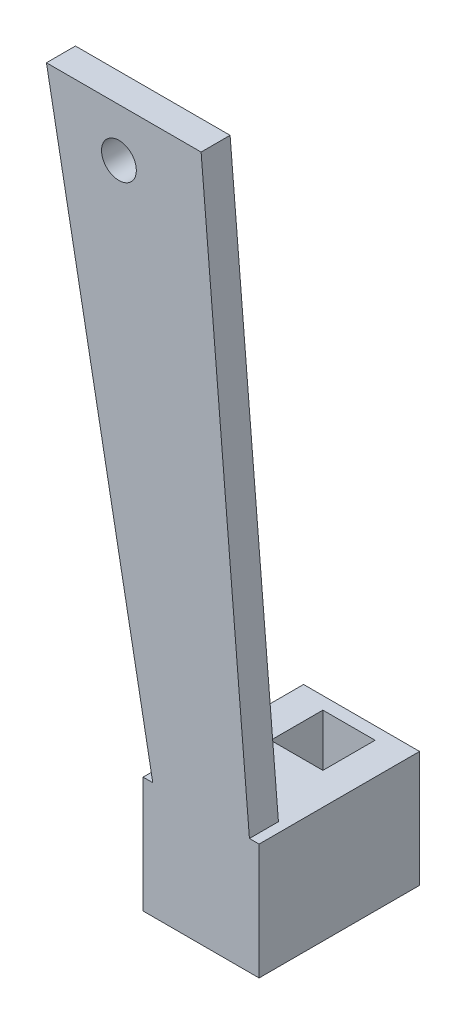
ISO-10303-21;
HEADER;
FILE_DESCRIPTION(('STEP AP214'),'2;1');
FILE_NAME('part.step','',(''),(''),'','','');
FILE_SCHEMA(('AUTOMOTIVE_DESIGN { 1 0 10303 214 1 1 1 1 }'));
ENDSEC;
DATA;
#1=APPLICATION_CONTEXT('core data for automotive mechanical design processes');
#2=APPLICATION_PROTOCOL_DEFINITION('international standard','automotive_design',2000,#1);
#3=PRODUCT_CONTEXT('',#1,'mechanical');
#4=PRODUCT('Part','Part','',(#3));
#5=PRODUCT_RELATED_PRODUCT_CATEGORY('part','',(#4));
#6=PRODUCT_DEFINITION_FORMATION('','',#4);
#7=PRODUCT_DEFINITION_CONTEXT('part definition',#1,'design');
#8=PRODUCT_DEFINITION('design','',#6,#7);
#9=PRODUCT_DEFINITION_SHAPE('','',#8);
#10=(LENGTH_UNIT() NAMED_UNIT(*) SI_UNIT(.MILLI.,.METRE.));
#11=(NAMED_UNIT(*) PLANE_ANGLE_UNIT() SI_UNIT($,.RADIAN.));
#12=(NAMED_UNIT(*) SI_UNIT($,.STERADIAN.) SOLID_ANGLE_UNIT());
#13=UNCERTAINTY_MEASURE_WITH_UNIT(LENGTH_MEASURE(1.E-05),#10,'distance_accuracy_value','');
#14=(GEOMETRIC_REPRESENTATION_CONTEXT(3) GLOBAL_UNCERTAINTY_ASSIGNED_CONTEXT((#13)) GLOBAL_UNIT_ASSIGNED_CONTEXT((#10,
#11,#12)) REPRESENTATION_CONTEXT('',''));
#15=CARTESIAN_POINT('',(0.,0.,0.));
#16=DIRECTION('',(0.,0.,1.));
#17=DIRECTION('',(1.,0.,0.));
#18=AXIS2_PLACEMENT_3D('',#15,#16,#17);
#19=CARTESIAN_POINT('',(6.,6.,12.6));
#20=DIRECTION('',(0.,-1.,0.));
#21=DIRECTION('',(0.,0.,-1.));
#22=AXIS2_PLACEMENT_3D('',#19,#20,#21);
#23=PLANE('',#22);
#24=DIRECTION('',(-1.,0.,0.));
#25=VECTOR('',#24,1.);
#26=CARTESIAN_POINT('',(6.,6.,2.7));
#27=LINE('',#26,#25);
#28=CARTESIAN_POINT('',(2.7,6.,2.7));
#29=VERTEX_POINT('',#28);
#30=CARTESIAN_POINT('',(-2.7,6.,2.7));
#31=VERTEX_POINT('',#30);
#32=EDGE_CURVE('E181',#29,#31,#27,.T.);
#33=ORIENTED_EDGE('',*,*,#32,.T.);
#34=DIRECTION('',(0.,0.,-1.));
#35=VECTOR('',#34,1.);
#36=CARTESIAN_POINT('',(-2.7,6.,12.6));
#37=LINE('',#36,#35);
#38=CARTESIAN_POINT('',(-2.7,6.,-2.7));
#39=VERTEX_POINT('',#38);
#40=EDGE_CURVE('E11',#31,#39,#37,.T.);
#41=ORIENTED_EDGE('',*,*,#40,.T.);
#42=DIRECTION('',(1.,0.,0.));
#43=VECTOR('',#42,1.);
#44=CARTESIAN_POINT('',(6.,6.,-2.7));
#45=LINE('',#44,#43);
#46=CARTESIAN_POINT('',(2.7,6.,-2.7));
#47=VERTEX_POINT('',#46);
#48=EDGE_CURVE('E48',#39,#47,#45,.T.);
#49=ORIENTED_EDGE('',*,*,#48,.T.);
#50=DIRECTION('',(0.,0.,1.));
#51=VECTOR('',#50,1.);
#52=CARTESIAN_POINT('',(2.7,6.,12.6));
#53=LINE('',#52,#51);
#54=EDGE_CURVE('E187',#47,#29,#53,.T.);
#55=ORIENTED_EDGE('',*,*,#54,.T.);
#56=EDGE_LOOP('',(#33,#41,#49,#55));
#57=FACE_BOUND('',#56,.T.);
#58=DIRECTION('',(0.,0.,-1.));
#59=VECTOR('',#58,1.);
#60=CARTESIAN_POINT('',(5.,6.,12.6));
#61=LINE('',#60,#59);
#62=CARTESIAN_POINT('',(5.,6.,12.6));
#63=VERTEX_POINT('',#62);
#64=CARTESIAN_POINT('',(5.,6.,9.6));
#65=VERTEX_POINT('',#64);
#66=EDGE_CURVE('E146',#63,#65,#61,.T.);
#67=ORIENTED_EDGE('',*,*,#66,.F.);
#68=DIRECTION('',(-1.,0.,0.));
#69=VECTOR('',#68,1.);
#70=CARTESIAN_POINT('',(6.,6.,12.6));
#71=LINE('',#70,#69);
#72=CARTESIAN_POINT('',(6.,6.,12.6));
#73=VERTEX_POINT('',#72);
#74=EDGE_CURVE('E152',#73,#63,#71,.T.);
#75=ORIENTED_EDGE('',*,*,#74,.F.);
#76=DIRECTION('',(0.,0.,-1.));
#77=VECTOR('',#76,1.);
#78=CARTESIAN_POINT('',(6.,6.,12.6));
#79=LINE('',#78,#77);
#80=CARTESIAN_POINT('',(6.,6.,-4.));
#81=VERTEX_POINT('',#80);
#82=EDGE_CURVE('E174',#73,#81,#79,.T.);
#83=ORIENTED_EDGE('',*,*,#82,.T.);
#84=DIRECTION('',(-1.,0.,0.));
#85=VECTOR('',#84,1.);
#86=CARTESIAN_POINT('',(6.,6.,-4.));
#87=LINE('',#86,#85);
#88=CARTESIAN_POINT('',(-6.,6.,-4.));
#89=VERTEX_POINT('',#88);
#90=EDGE_CURVE('E168',#81,#89,#87,.T.);
#91=ORIENTED_EDGE('',*,*,#90,.T.);
#92=DIRECTION('',(0.,0.,-1.));
#93=VECTOR('',#92,1.);
#94=CARTESIAN_POINT('',(-6.,6.,12.6));
#95=LINE('',#94,#93);
#96=CARTESIAN_POINT('',(-6.,6.,12.6));
#97=VERTEX_POINT('',#96);
#98=EDGE_CURVE('E155',#97,#89,#95,.T.);
#99=ORIENTED_EDGE('',*,*,#98,.F.);
#100=CARTESIAN_POINT('',(-5.,6.,12.6));
#101=VERTEX_POINT('',#100);
#102=EDGE_CURVE('E134',#101,#97,#71,.T.);
#103=ORIENTED_EDGE('',*,*,#102,.F.);
#104=DIRECTION('',(0.,0.,-1.));
#105=VECTOR('',#104,1.);
#106=CARTESIAN_POINT('',(-5.,6.,12.6));
#107=LINE('',#106,#105);
#108=CARTESIAN_POINT('',(-5.,6.,9.6));
#109=VERTEX_POINT('',#108);
#110=EDGE_CURVE('E141',#101,#109,#107,.T.);
#111=ORIENTED_EDGE('',*,*,#110,.T.);
#112=DIRECTION('',(1.,0.,0.));
#113=VECTOR('',#112,1.);
#114=CARTESIAN_POINT('',(-5.,6.,9.6));
#115=LINE('',#114,#113);
#116=EDGE_CURVE('E249',#109,#65,#115,.T.);
#117=ORIENTED_EDGE('',*,*,#116,.T.);
#118=EDGE_LOOP('',(#67,#75,#83,#91,#99,#103,#111,#117));
#119=FACE_BOUND('',#118,.T.);
#120=ADVANCED_FACE('F39',(#57,#119),#23,.F.);
#121=CARTESIAN_POINT('',(-6.,6.,12.6));
#122=DIRECTION('',(1.,0.,0.));
#123=DIRECTION('',(0.,0.,-1.));
#124=AXIS2_PLACEMENT_3D('',#121,#122,#123);
#125=PLANE('',#124);
#126=DIRECTION('',(0.,-1.,0.));
#127=VECTOR('',#126,1.);
#128=CARTESIAN_POINT('',(-6.,6.,-4.));
#129=LINE('',#128,#127);
#130=CARTESIAN_POINT('',(-6.,-6.,-4.));
#131=VERTEX_POINT('',#130);
#132=EDGE_CURVE('E165',#89,#131,#129,.T.);
#133=ORIENTED_EDGE('',*,*,#132,.T.);
#134=DIRECTION('',(0.,0.,-1.));
#135=VECTOR('',#134,1.);
#136=CARTESIAN_POINT('',(-6.,-6.,12.6));
#137=LINE('',#136,#135);
#138=CARTESIAN_POINT('',(-6.,-6.,12.6));
#139=VERTEX_POINT('',#138);
#140=EDGE_CURVE('E180',#139,#131,#137,.T.);
#141=ORIENTED_EDGE('',*,*,#140,.F.);
#142=DIRECTION('',(0.,-1.,0.));
#143=VECTOR('',#142,1.);
#144=CARTESIAN_POINT('',(-6.,6.,12.6));
#145=LINE('',#144,#143);
#146=EDGE_CURVE('E175',#97,#139,#145,.T.);
#147=ORIENTED_EDGE('',*,*,#146,.F.);
#148=ORIENTED_EDGE('',*,*,#98,.T.);
#149=EDGE_LOOP('',(#133,#141,#147,#148));
#150=FACE_BOUND('',#149,.T.);
#151=ADVANCED_FACE('F41',(#150),#125,.F.);
#152=CARTESIAN_POINT('',(-6.,-6.,12.6));
#153=DIRECTION('',(0.,1.,0.));
#154=DIRECTION('',(0.,0.,1.));
#155=AXIS2_PLACEMENT_3D('',#152,#153,#154);
#156=PLANE('',#155);
#157=DIRECTION('',(-1.,0.,0.));
#158=VECTOR('',#157,1.);
#159=CARTESIAN_POINT('',(-6.,-6.,-2.7));
#160=LINE('',#159,#158);
#161=CARTESIAN_POINT('',(2.7,-6.,-2.7));
#162=VERTEX_POINT('',#161);
#163=CARTESIAN_POINT('',(-2.7,-6.,-2.7));
#164=VERTEX_POINT('',#163);
#165=EDGE_CURVE('E220',#162,#164,#160,.T.);
#166=ORIENTED_EDGE('',*,*,#165,.T.);
#167=DIRECTION('',(0.,0.,1.));
#168=VECTOR('',#167,1.);
#169=CARTESIAN_POINT('',(-2.7,-6.,12.6));
#170=LINE('',#169,#168);
#171=CARTESIAN_POINT('',(-2.7,-6.,2.7));
#172=VERTEX_POINT('',#171);
#173=EDGE_CURVE('E167',#164,#172,#170,.T.);
#174=ORIENTED_EDGE('',*,*,#173,.T.);
#175=DIRECTION('',(1.,0.,0.));
#176=VECTOR('',#175,1.);
#177=CARTESIAN_POINT('',(-6.,-6.,2.7));
#178=LINE('',#177,#176);
#179=CARTESIAN_POINT('',(2.7,-6.,2.7));
#180=VERTEX_POINT('',#179);
#181=EDGE_CURVE('E202',#172,#180,#178,.T.);
#182=ORIENTED_EDGE('',*,*,#181,.T.);
#183=DIRECTION('',(0.,0.,-1.));
#184=VECTOR('',#183,1.);
#185=CARTESIAN_POINT('',(2.7,-6.,12.6));
#186=LINE('',#185,#184);
#187=EDGE_CURVE('E208',#180,#162,#186,.T.);
#188=ORIENTED_EDGE('',*,*,#187,.T.);
#189=EDGE_LOOP('',(#166,#174,#182,#188));
#190=FACE_BOUND('',#189,.T.);
#191=DIRECTION('',(1.,0.,0.));
#192=VECTOR('',#191,1.);
#193=CARTESIAN_POINT('',(-6.,-6.,-4.));
#194=LINE('',#193,#192);
#195=CARTESIAN_POINT('',(6.,-6.,-4.));
#196=VERTEX_POINT('',#195);
#197=EDGE_CURVE('E164',#131,#196,#194,.T.);
#198=ORIENTED_EDGE('',*,*,#197,.T.);
#199=DIRECTION('',(0.,0.,-1.));
#200=VECTOR('',#199,1.);
#201=CARTESIAN_POINT('',(6.,-6.,12.6));
#202=LINE('',#201,#200);
#203=CARTESIAN_POINT('',(6.,-6.,12.6));
#204=VERTEX_POINT('',#203);
#205=EDGE_CURVE('E177',#204,#196,#202,.T.);
#206=ORIENTED_EDGE('',*,*,#205,.F.);
#207=DIRECTION('',(1.,0.,0.));
#208=VECTOR('',#207,1.);
#209=CARTESIAN_POINT('',(-6.,-6.,12.6));
#210=LINE('',#209,#208);
#211=EDGE_CURVE('E158',#139,#204,#210,.T.);
#212=ORIENTED_EDGE('',*,*,#211,.F.);
#213=ORIENTED_EDGE('',*,*,#140,.T.);
#214=EDGE_LOOP('',(#198,#206,#212,#213));
#215=FACE_BOUND('',#214,.T.);
#216=ADVANCED_FACE('F223',(#190,#215),#156,.F.);
#217=CARTESIAN_POINT('',(6.,-6.,12.6));
#218=DIRECTION('',(-1.,0.,0.));
#219=DIRECTION('',(0.,0.,1.));
#220=AXIS2_PLACEMENT_3D('',#217,#218,#219);
#221=PLANE('',#220);
#222=DIRECTION('',(0.,1.,0.));
#223=VECTOR('',#222,1.);
#224=CARTESIAN_POINT('',(6.,-6.,-4.));
#225=LINE('',#224,#223);
#226=EDGE_CURVE('E169',#196,#81,#225,.T.);
#227=ORIENTED_EDGE('',*,*,#226,.T.);
#228=ORIENTED_EDGE('',*,*,#82,.F.);
#229=DIRECTION('',(0.,1.,0.));
#230=VECTOR('',#229,1.);
#231=CARTESIAN_POINT('',(6.,-6.,12.6));
#232=LINE('',#231,#230);
#233=EDGE_CURVE('E154',#204,#73,#232,.T.);
#234=ORIENTED_EDGE('',*,*,#233,.F.);
#235=ORIENTED_EDGE('',*,*,#205,.T.);
#236=EDGE_LOOP('',(#227,#228,#234,#235));
#237=FACE_BOUND('',#236,.T.);
#238=ADVANCED_FACE('F228',(#237),#221,.F.);
#239=CARTESIAN_POINT('',(0.,0.,12.6));
#240=DIRECTION('',(0.,0.,1.));
#241=DIRECTION('',(1.,0.,0.));
#242=AXIS2_PLACEMENT_3D('',#239,#240,#241);
#243=PLANE('',#242);
#244=CARTESIAN_POINT('',(-8.5,60.,12.6));
#245=DIRECTION('',(0.,0.,1.));
#246=DIRECTION('',(1.,0.,0.));
#247=AXIS2_PLACEMENT_3D('',#244,#245,#246);
#248=CIRCLE('',#247,1.8);
#249=CARTESIAN_POINT('',(-6.7,60.,12.6));
#250=VERTEX_POINT('',#249);
#251=EDGE_CURVE('E248',#250,#250,#248,.T.);
#252=ORIENTED_EDGE('',*,*,#251,.F.);
#253=EDGE_LOOP('',(#252));
#254=FACE_BOUND('',#253,.T.);
#255=ORIENTED_EDGE('',*,*,#146,.T.);
#256=ORIENTED_EDGE('',*,*,#211,.T.);
#257=ORIENTED_EDGE('',*,*,#233,.T.);
#258=ORIENTED_EDGE('',*,*,#74,.T.);
#259=DIRECTION('',(-0.0844430766861806,0.996428304896931,0.));
#260=VECTOR('',#259,1.);
#261=CARTESIAN_POINT('',(5.,6.,12.6));
#262=LINE('',#261,#260);
#263=CARTESIAN_POINT('',(0.,65.,12.6));
#264=VERTEX_POINT('',#263);
#265=EDGE_CURVE('E138',#63,#264,#262,.T.);
#266=ORIENTED_EDGE('',*,*,#265,.T.);
#267=DIRECTION('',(-1.,0.,0.));
#268=VECTOR('',#267,1.);
#269=CARTESIAN_POINT('',(0.,65.,12.6));
#270=LINE('',#269,#268);
#271=CARTESIAN_POINT('',(-16.,65.,12.6));
#272=VERTEX_POINT('',#271);
#273=EDGE_CURVE('E137',#264,#272,#270,.T.);
#274=ORIENTED_EDGE('',*,*,#273,.T.);
#275=DIRECTION('',(0.183282428616724,-0.983060298944249,0.));
#276=VECTOR('',#275,1.);
#277=CARTESIAN_POINT('',(-16.,65.,12.6));
#278=LINE('',#277,#276);
#279=EDGE_CURVE('E128',#272,#101,#278,.T.);
#280=ORIENTED_EDGE('',*,*,#279,.T.);
#281=ORIENTED_EDGE('',*,*,#102,.T.);
#282=EDGE_LOOP('',(#255,#256,#257,#258,#266,#274,#280,#281));
#283=FACE_BOUND('',#282,.T.);
#284=ADVANCED_FACE('F135',(#254,#283),#243,.T.);
#285=CARTESIAN_POINT('',(0.,0.,-4.));
#286=DIRECTION('',(0.,0.,1.));
#287=DIRECTION('',(1.,0.,0.));
#288=AXIS2_PLACEMENT_3D('',#285,#286,#287);
#289=PLANE('',#288);
#290=ORIENTED_EDGE('',*,*,#132,.F.);
#291=ORIENTED_EDGE('',*,*,#90,.F.);
#292=ORIENTED_EDGE('',*,*,#226,.F.);
#293=ORIENTED_EDGE('',*,*,#197,.F.);
#294=EDGE_LOOP('',(#290,#291,#292,#293));
#295=FACE_BOUND('',#294,.T.);
#296=ADVANCED_FACE('F280',(#295),#289,.F.);
#297=CARTESIAN_POINT('',(-2.7,-12.,-2.7));
#298=DIRECTION('',(-1.,0.,0.));
#299=DIRECTION('',(0.,0.,1.));
#300=AXIS2_PLACEMENT_3D('',#297,#298,#299);
#301=PLANE('',#300);
#302=DIRECTION('',(0.,1.,0.));
#303=VECTOR('',#302,1.);
#304=CARTESIAN_POINT('',(-2.7,-12.,-2.7));
#305=LINE('',#304,#303);
#306=EDGE_CURVE('E197',#164,#39,#305,.T.);
#307=ORIENTED_EDGE('',*,*,#306,.T.);
#308=ORIENTED_EDGE('',*,*,#40,.F.);
#309=DIRECTION('',(0.,1.,0.));
#310=VECTOR('',#309,1.);
#311=CARTESIAN_POINT('',(-2.7,-12.,2.7));
#312=LINE('',#311,#310);
#313=EDGE_CURVE('E150',#172,#31,#312,.T.);
#314=ORIENTED_EDGE('',*,*,#313,.F.);
#315=ORIENTED_EDGE('',*,*,#173,.F.);
#316=EDGE_LOOP('',(#307,#308,#314,#315));
#317=FACE_BOUND('',#316,.T.);
#318=ADVANCED_FACE('F205',(#317),#301,.F.);
#319=CARTESIAN_POINT('',(2.7,-12.,-2.7));
#320=DIRECTION('',(0.,0.,-1.));
#321=DIRECTION('',(-1.,0.,0.));
#322=AXIS2_PLACEMENT_3D('',#319,#320,#321);
#323=PLANE('',#322);
#324=DIRECTION('',(0.,1.,0.));
#325=VECTOR('',#324,1.);
#326=CARTESIAN_POINT('',(2.7,-12.,-2.7));
#327=LINE('',#326,#325);
#328=EDGE_CURVE('E199',#162,#47,#327,.T.);
#329=ORIENTED_EDGE('',*,*,#328,.T.);
#330=ORIENTED_EDGE('',*,*,#48,.F.);
#331=ORIENTED_EDGE('',*,*,#306,.F.);
#332=ORIENTED_EDGE('',*,*,#165,.F.);
#333=EDGE_LOOP('',(#329,#330,#331,#332));
#334=FACE_BOUND('',#333,.T.);
#335=ADVANCED_FACE('F198',(#334),#323,.F.);
#336=CARTESIAN_POINT('',(2.7,-12.,2.7));
#337=DIRECTION('',(1.,0.,0.));
#338=DIRECTION('',(0.,0.,-1.));
#339=AXIS2_PLACEMENT_3D('',#336,#337,#338);
#340=PLANE('',#339);
#341=DIRECTION('',(0.,1.,0.));
#342=VECTOR('',#341,1.);
#343=CARTESIAN_POINT('',(2.7,-12.,2.7));
#344=LINE('',#343,#342);
#345=EDGE_CURVE('E63',#180,#29,#344,.T.);
#346=ORIENTED_EDGE('',*,*,#345,.T.);
#347=ORIENTED_EDGE('',*,*,#54,.F.);
#348=ORIENTED_EDGE('',*,*,#328,.F.);
#349=ORIENTED_EDGE('',*,*,#187,.F.);
#350=EDGE_LOOP('',(#346,#347,#348,#349));
#351=FACE_BOUND('',#350,.T.);
#352=ADVANCED_FACE('F287',(#351),#340,.F.);
#353=CARTESIAN_POINT('',(-2.7,-12.,2.7));
#354=DIRECTION('',(0.,0.,1.));
#355=DIRECTION('',(1.,0.,0.));
#356=AXIS2_PLACEMENT_3D('',#353,#354,#355);
#357=PLANE('',#356);
#358=ORIENTED_EDGE('',*,*,#313,.T.);
#359=ORIENTED_EDGE('',*,*,#32,.F.);
#360=ORIENTED_EDGE('',*,*,#345,.F.);
#361=ORIENTED_EDGE('',*,*,#181,.F.);
#362=EDGE_LOOP('',(#358,#359,#360,#361));
#363=FACE_BOUND('',#362,.T.);
#364=ADVANCED_FACE('F289',(#363),#357,.F.);
#365=CARTESIAN_POINT('',(-16.,65.,12.6));
#366=DIRECTION('',(0.983060298944249,0.183282428616724,0.));
#367=DIRECTION('',(-0.183282428616724,0.983060298944249,0.));
#368=AXIS2_PLACEMENT_3D('',#365,#366,#367);
#369=PLANE('',#368);
#370=DIRECTION('',(0.183282428616724,-0.983060298944249,0.));
#371=VECTOR('',#370,1.);
#372=CARTESIAN_POINT('',(-16.,65.,9.6));
#373=LINE('',#372,#371);
#374=CARTESIAN_POINT('',(-16.,65.,9.6));
#375=VERTEX_POINT('',#374);
#376=EDGE_CURVE('E54',#375,#109,#373,.T.);
#377=ORIENTED_EDGE('',*,*,#376,.T.);
#378=ORIENTED_EDGE('',*,*,#110,.F.);
#379=ORIENTED_EDGE('',*,*,#279,.F.);
#380=DIRECTION('',(0.,0.,-1.));
#381=VECTOR('',#380,1.);
#382=CARTESIAN_POINT('',(-16.,65.,12.6));
#383=LINE('',#382,#381);
#384=EDGE_CURVE('E242',#272,#375,#383,.T.);
#385=ORIENTED_EDGE('',*,*,#384,.T.);
#386=EDGE_LOOP('',(#377,#378,#379,#385));
#387=FACE_BOUND('',#386,.T.);
#388=ADVANCED_FACE('F145',(#387),#369,.F.);
#389=CARTESIAN_POINT('',(5.,6.,12.6));
#390=DIRECTION('',(-0.996428304896931,-0.0844430766861806,0.));
#391=DIRECTION('',(0.0844430766861806,-0.996428304896931,0.));
#392=AXIS2_PLACEMENT_3D('',#389,#390,#391);
#393=PLANE('',#392);
#394=DIRECTION('',(-0.0844430766861806,0.996428304896931,0.));
#395=VECTOR('',#394,1.);
#396=CARTESIAN_POINT('',(5.,6.,9.6));
#397=LINE('',#396,#395);
#398=CARTESIAN_POINT('',(0.,65.,9.6));
#399=VERTEX_POINT('',#398);
#400=EDGE_CURVE('E236',#65,#399,#397,.T.);
#401=ORIENTED_EDGE('',*,*,#400,.T.);
#402=DIRECTION('',(0.,0.,-1.));
#403=VECTOR('',#402,1.);
#404=CARTESIAN_POINT('',(0.,65.,12.6));
#405=LINE('',#404,#403);
#406=EDGE_CURVE('E235',#264,#399,#405,.T.);
#407=ORIENTED_EDGE('',*,*,#406,.F.);
#408=ORIENTED_EDGE('',*,*,#265,.F.);
#409=ORIENTED_EDGE('',*,*,#66,.T.);
#410=EDGE_LOOP('',(#401,#407,#408,#409));
#411=FACE_BOUND('',#410,.T.);
#412=ADVANCED_FACE('F237',(#411),#393,.F.);
#413=CARTESIAN_POINT('',(0.,65.,12.6));
#414=DIRECTION('',(0.,-1.,0.));
#415=DIRECTION('',(0.,0.,-1.));
#416=AXIS2_PLACEMENT_3D('',#413,#414,#415);
#417=PLANE('',#416);
#418=DIRECTION('',(-1.,0.,0.));
#419=VECTOR('',#418,1.);
#420=CARTESIAN_POINT('',(0.,65.,9.6));
#421=LINE('',#420,#419);
#422=EDGE_CURVE('E140',#399,#375,#421,.T.);
#423=ORIENTED_EDGE('',*,*,#422,.T.);
#424=ORIENTED_EDGE('',*,*,#384,.F.);
#425=ORIENTED_EDGE('',*,*,#273,.F.);
#426=ORIENTED_EDGE('',*,*,#406,.T.);
#427=EDGE_LOOP('',(#423,#424,#425,#426));
#428=FACE_BOUND('',#427,.T.);
#429=ADVANCED_FACE('F243',(#428),#417,.F.);
#430=CARTESIAN_POINT('',(0.,0.,9.6));
#431=DIRECTION('',(0.,0.,1.));
#432=DIRECTION('',(1.,0.,0.));
#433=AXIS2_PLACEMENT_3D('',#430,#431,#432);
#434=PLANE('',#433);
#435=CARTESIAN_POINT('',(-8.5,60.,9.6));
#436=DIRECTION('',(0.,0.,1.));
#437=DIRECTION('',(1.,0.,0.));
#438=AXIS2_PLACEMENT_3D('',#435,#436,#437);
#439=CIRCLE('',#438,1.8);
#440=CARTESIAN_POINT('',(-6.7,60.,9.6));
#441=VERTEX_POINT('',#440);
#442=EDGE_CURVE('E43',#441,#441,#439,.T.);
#443=ORIENTED_EDGE('',*,*,#442,.T.);
#444=EDGE_LOOP('',(#443));
#445=FACE_BOUND('',#444,.T.);
#446=ORIENTED_EDGE('',*,*,#376,.F.);
#447=ORIENTED_EDGE('',*,*,#422,.F.);
#448=ORIENTED_EDGE('',*,*,#400,.F.);
#449=ORIENTED_EDGE('',*,*,#116,.F.);
#450=EDGE_LOOP('',(#446,#447,#448,#449));
#451=FACE_BOUND('',#450,.T.);
#452=ADVANCED_FACE('F251',(#445,#451),#434,.F.);
#453=CARTESIAN_POINT('',(-8.5,60.,-25.2));
#454=DIRECTION('',(0.,0.,1.));
#455=DIRECTION('',(1.,0.,0.));
#456=AXIS2_PLACEMENT_3D('',#453,#454,#455);
#457=CYLINDRICAL_SURFACE('',#456,1.8);
#458=ORIENTED_EDGE('',*,*,#251,.T.);
#459=EDGE_LOOP('',(#458));
#460=FACE_BOUND('',#459,.T.);
#461=ORIENTED_EDGE('',*,*,#442,.F.);
#462=EDGE_LOOP('',(#461));
#463=FACE_BOUND('',#462,.T.);
#464=ADVANCED_FACE('F254',(#460,#463),#457,.F.);
#465=CLOSED_SHELL('',(#120,#151,#216,#238,#284,#296,#318,#335,#352,#364,#388,#412,#429,#452,#464));
#466=MANIFOLD_SOLID_BREP('B2',#465);
#467=ADVANCED_BREP_SHAPE_REPRESENTATION('',(#18,#466),#14);
#468=SHAPE_DEFINITION_REPRESENTATION(#9,#467);
ENDSEC;
END-ISO-10303-21;
